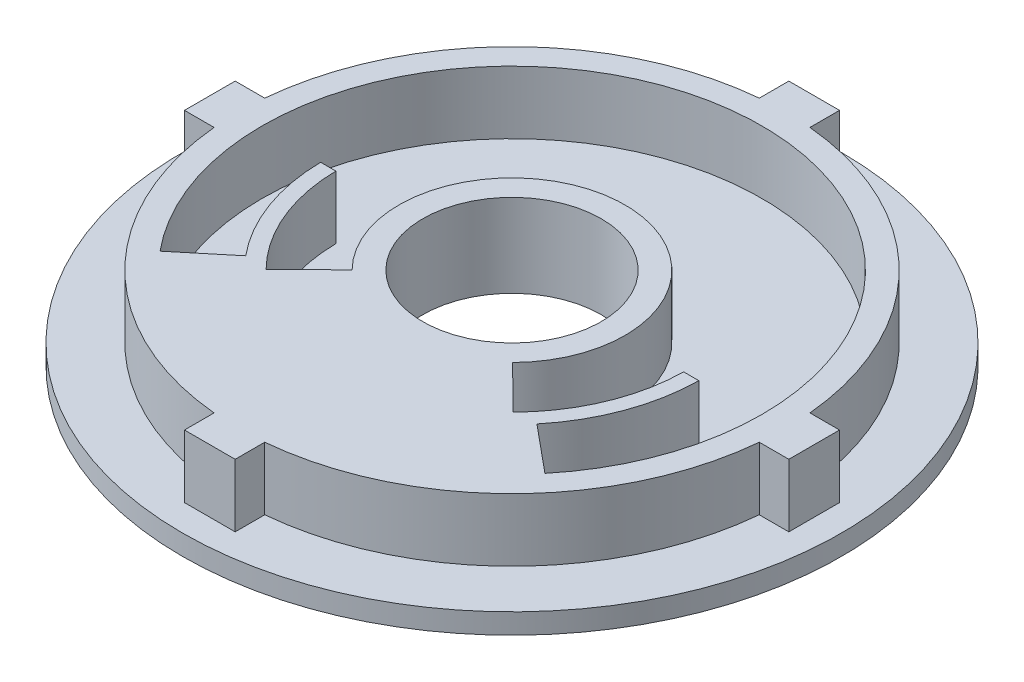
ISO-10303-21;
HEADER;
FILE_DESCRIPTION(('STEP AP214'),'2;1');
FILE_NAME('part.step','',(''),(''),'','','');
FILE_SCHEMA(('AUTOMOTIVE_DESIGN { 1 0 10303 214 1 1 1 1 }'));
ENDSEC;
DATA;
#1=APPLICATION_CONTEXT('core data for automotive mechanical design processes');
#2=APPLICATION_PROTOCOL_DEFINITION('international standard','automotive_design',2000,#1);
#3=PRODUCT_CONTEXT('',#1,'mechanical');
#4=PRODUCT('Part','Part','',(#3));
#5=PRODUCT_RELATED_PRODUCT_CATEGORY('part','',(#4));
#6=PRODUCT_DEFINITION_FORMATION('','',#4);
#7=PRODUCT_DEFINITION_CONTEXT('part definition',#1,'design');
#8=PRODUCT_DEFINITION('design','',#6,#7);
#9=PRODUCT_DEFINITION_SHAPE('','',#8);
#10=(LENGTH_UNIT() NAMED_UNIT(*) SI_UNIT(.MILLI.,.METRE.));
#11=(NAMED_UNIT(*) PLANE_ANGLE_UNIT() SI_UNIT($,.RADIAN.));
#12=(NAMED_UNIT(*) SI_UNIT($,.STERADIAN.) SOLID_ANGLE_UNIT());
#13=UNCERTAINTY_MEASURE_WITH_UNIT(LENGTH_MEASURE(1.E-05),#10,'distance_accuracy_value','');
#14=(GEOMETRIC_REPRESENTATION_CONTEXT(3) GLOBAL_UNCERTAINTY_ASSIGNED_CONTEXT((#13)) GLOBAL_UNIT_ASSIGNED_CONTEXT((#10,
#11,#12)) REPRESENTATION_CONTEXT('',''));
#15=CARTESIAN_POINT('',(0.,0.,0.));
#16=DIRECTION('',(0.,0.,1.));
#17=DIRECTION('',(1.,0.,0.));
#18=AXIS2_PLACEMENT_3D('',#15,#16,#17);
#19=CARTESIAN_POINT('',(0.,6.2,0.));
#20=DIRECTION('',(0.,-1.,0.));
#21=DIRECTION('',(0.,0.,-1.));
#22=AXIS2_PLACEMENT_3D('',#19,#20,#21);
#23=CYLINDRICAL_SURFACE('',#22,18.65);
#24=CARTESIAN_POINT('',(0.,0.,0.));
#25=DIRECTION('',(0.,-1.,0.));
#26=DIRECTION('',(0.,0.,-1.));
#27=AXIS2_PLACEMENT_3D('',#24,#25,#26);
#28=CIRCLE('',#27,18.65);
#29=CARTESIAN_POINT('',(-14.3583068280382,0.,11.9021647204158));
#30=VERTEX_POINT('',#29);
#31=CARTESIAN_POINT('',(-18.6486866118202,0.,0.221331547946306));
#32=VERTEX_POINT('',#31);
#33=EDGE_CURVE('E294',#30,#32,#28,.T.);
#34=ORIENTED_EDGE('',*,*,#33,.F.);
#35=DIRECTION('',(0.,-1.,0.));
#36=VECTOR('',#35,1.);
#37=CARTESIAN_POINT('',(-14.3583068280382,6.2,11.9021647204158));
#38=LINE('',#37,#36);
#39=CARTESIAN_POINT('',(-14.3583068280382,6.2,11.9021647204158));
#40=VERTEX_POINT('',#39);
#41=EDGE_CURVE('E239',#30,#40,#38,.F.);
#42=ORIENTED_EDGE('',*,*,#41,.T.);
#43=CARTESIAN_POINT('',(0.,6.2,0.));
#44=DIRECTION('',(0.,-1.,0.));
#45=DIRECTION('',(0.,0.,-1.));
#46=AXIS2_PLACEMENT_3D('',#43,#44,#45);
#47=CIRCLE('',#46,18.65);
#48=CARTESIAN_POINT('',(-18.6486866118202,6.2,0.221331547946306));
#49=VERTEX_POINT('',#48);
#50=EDGE_CURVE('E225',#40,#49,#47,.T.);
#51=ORIENTED_EDGE('',*,*,#50,.T.);
#52=DIRECTION('',(0.,-1.,0.));
#53=VECTOR('',#52,1.);
#54=CARTESIAN_POINT('',(-18.6486866118202,6.2,0.221331547946306));
#55=LINE('',#54,#53);
#56=EDGE_CURVE('E255',#49,#32,#55,.T.);
#57=ORIENTED_EDGE('',*,*,#56,.T.);
#58=EDGE_LOOP('',(#34,#42,#51,#57));
#59=FACE_BOUND('',#58,.T.);
#60=ADVANCED_FACE('F37',(#59),#23,.T.);
#61=CARTESIAN_POINT('',(0.,6.2,0.));
#62=DIRECTION('',(0.,-1.,0.));
#63=DIRECTION('',(0.,0.,-1.));
#64=AXIS2_PLACEMENT_3D('',#61,#62,#63);
#65=CYLINDRICAL_SURFACE('',#64,24.65);
#66=DIRECTION('',(0.,-1.,0.));
#67=VECTOR('',#66,1.);
#68=CARTESIAN_POINT('',(18.9776012499272,16.1484826050477,15.7312793757775));
#69=LINE('',#68,#67);
#70=CARTESIAN_POINT('',(18.9776012499272,6.2,15.7312793757774));
#71=VERTEX_POINT('',#70);
#72=CARTESIAN_POINT('',(18.9776012499272,0.,15.7312793757774));
#73=VERTEX_POINT('',#72);
#74=EDGE_CURVE('E59',#71,#73,#69,.T.);
#75=ORIENTED_EDGE('',*,*,#74,.F.);
#76=CARTESIAN_POINT('',(0.,6.2,0.));
#77=DIRECTION('',(0.,1.,0.));
#78=DIRECTION('',(0.,0.,1.));
#79=AXIS2_PLACEMENT_3D('',#76,#77,#78);
#80=CIRCLE('',#79,24.65);
#81=CARTESIAN_POINT('',(-18.9776012499272,6.2,15.7312793757774));
#82=VERTEX_POINT('',#81);
#83=EDGE_CURVE('E231',#71,#82,#80,.T.);
#84=ORIENTED_EDGE('',*,*,#83,.T.);
#85=DIRECTION('',(0.,-1.,0.));
#86=VECTOR('',#85,1.);
#87=CARTESIAN_POINT('',(-18.9776012499272,16.1484826050477,15.7312793757775));
#88=LINE('',#87,#86);
#89=CARTESIAN_POINT('',(-18.9776012499272,0.,15.7312793757775));
#90=VERTEX_POINT('',#89);
#91=EDGE_CURVE('E229',#82,#90,#88,.T.);
#92=ORIENTED_EDGE('',*,*,#91,.T.);
#93=CARTESIAN_POINT('',(0.,0.,0.));
#94=DIRECTION('',(0.,1.,0.));
#95=DIRECTION('',(0.,0.,1.));
#96=AXIS2_PLACEMENT_3D('',#93,#94,#95);
#97=CIRCLE('',#96,24.65);
#98=EDGE_CURVE('E220',#73,#90,#97,.T.);
#99=ORIENTED_EDGE('',*,*,#98,.F.);
#100=EDGE_LOOP('',(#75,#84,#92,#99));
#101=FACE_BOUND('',#100,.T.);
#102=ADVANCED_FACE('F230',(#101),#65,.F.);
#103=CARTESIAN_POINT('',(0.,0.,0.));
#104=DIRECTION('',(0.,-1.,0.));
#105=DIRECTION('',(0.,0.,-1.));
#106=AXIS2_PLACEMENT_3D('',#103,#104,#105);
#107=PLANE('',#106);
#108=CARTESIAN_POINT('',(0.,0.,0.));
#109=DIRECTION('',(0.,-1.,0.));
#110=DIRECTION('',(0.,0.,1.));
#111=AXIS2_PLACEMENT_3D('',#108,#109,#110);
#112=CIRCLE('',#111,18.65);
#113=CARTESIAN_POINT('',(18.6486866118202,0.,0.221331547946306));
#114=VERTEX_POINT('',#113);
#115=CARTESIAN_POINT('',(14.3583068280382,0.,11.9021647204158));
#116=VERTEX_POINT('',#115);
#117=EDGE_CURVE('E226',#114,#116,#112,.T.);
#118=ORIENTED_EDGE('',*,*,#117,.T.);
#119=DIRECTION('',(0.769882403648162,0.,0.638185775893609));
#120=VECTOR('',#119,1.);
#121=CARTESIAN_POINT('',(18.9776012499272,0.,15.7312793757775));
#122=LINE('',#121,#120);
#123=EDGE_CURVE('E52',#116,#73,#122,.T.);
#124=ORIENTED_EDGE('',*,*,#123,.T.);
#125=ORIENTED_EDGE('',*,*,#98,.T.);
#126=DIRECTION('',(-0.769882403648162,0.,0.638185775893609));
#127=VECTOR('',#126,1.);
#128=CARTESIAN_POINT('',(0.,0.,0.));
#129=LINE('',#128,#127);
#130=EDGE_CURVE('E45',#30,#90,#129,.T.);
#131=ORIENTED_EDGE('',*,*,#130,.F.);
#132=ORIENTED_EDGE('',*,*,#33,.T.);
#133=DIRECTION('',(0.999999999625579,0.,2.73649931491843E-05));
#134=VECTOR('',#133,1.);
#135=CARTESIAN_POINT('',(-18.6486866118202,0.,0.221331547946306));
#136=LINE('',#135,#134);
#137=CARTESIAN_POINT('',(-17.148571199158,0.,0.221372598594317));
#138=VERTEX_POINT('',#137);
#139=EDGE_CURVE('E291',#32,#138,#136,.T.);
#140=ORIENTED_EDGE('',*,*,#139,.T.);
#141=CARTESIAN_POINT('',(0.,0.,0.));
#142=DIRECTION('',(0.,1.,0.));
#143=DIRECTION('',(0.,0.,-1.));
#144=AXIS2_PLACEMENT_3D('',#141,#142,#143);
#145=CIRCLE('',#144,17.15);
#146=CARTESIAN_POINT('',(-12.1754563894523,0.,12.0781108501514));
#147=VERTEX_POINT('',#146);
#148=EDGE_CURVE('E289',#138,#147,#145,.T.);
#149=ORIENTED_EDGE('',*,*,#148,.T.);
#150=DIRECTION('',(0.709939148073023,0.,-0.704263023332441));
#151=VECTOR('',#150,1.);
#152=CARTESIAN_POINT('',(-12.1754563894523,0.,12.0781108501514));
#153=LINE('',#152,#151);
#154=CARTESIAN_POINT('',(-7.91582150101419,0.,7.85253271015673));
#155=VERTEX_POINT('',#154);
#156=EDGE_CURVE('E286',#147,#155,#153,.T.);
#157=ORIENTED_EDGE('',*,*,#156,.T.);
#158=CARTESIAN_POINT('',(0.,0.,0.));
#159=DIRECTION('',(0.,-1.,0.));
#160=DIRECTION('',(0.,0.,1.));
#161=AXIS2_PLACEMENT_3D('',#158,#159,#160);
#162=CIRCLE('',#161,11.15);
#163=CARTESIAN_POINT('',(7.9158215010142,0.,7.85253271015673));
#164=VERTEX_POINT('',#163);
#165=EDGE_CURVE('E283',#155,#164,#162,.T.);
#166=ORIENTED_EDGE('',*,*,#165,.T.);
#167=DIRECTION('',(0.709939148073023,0.,0.704263023332441));
#168=VECTOR('',#167,1.);
#169=CARTESIAN_POINT('',(12.1754563894523,0.,12.0781108501514));
#170=LINE('',#169,#168);
#171=CARTESIAN_POINT('',(12.1754563894523,0.,12.0781108501514));
#172=VERTEX_POINT('',#171);
#173=EDGE_CURVE('E280',#164,#172,#170,.T.);
#174=ORIENTED_EDGE('',*,*,#173,.T.);
#175=CARTESIAN_POINT('',(0.,0.,0.));
#176=DIRECTION('',(0.,1.,0.));
#177=DIRECTION('',(0.,0.,1.));
#178=AXIS2_PLACEMENT_3D('',#175,#176,#177);
#179=CIRCLE('',#178,17.15);
#180=CARTESIAN_POINT('',(17.148571199158,0.,0.221372598594312));
#181=VERTEX_POINT('',#180);
#182=EDGE_CURVE('E278',#172,#181,#179,.T.);
#183=ORIENTED_EDGE('',*,*,#182,.T.);
#184=DIRECTION('',(0.999999999625579,0.,-2.73649931491843E-05));
#185=VECTOR('',#184,1.);
#186=CARTESIAN_POINT('',(18.6486866118202,0.,0.221331547946306));
#187=LINE('',#186,#185);
#188=EDGE_CURVE('E275',#181,#114,#187,.T.);
#189=ORIENTED_EDGE('',*,*,#188,.T.);
#190=EDGE_LOOP('',(#118,#124,#125,#131,#132,#140,#149,#157,#166,#174,#183,#189));
#191=FACE_BOUND('',#190,.T.);
#192=ADVANCED_FACE('F222',(#191),#107,.F.);
#193=CARTESIAN_POINT('',(0.,6.2,0.));
#194=DIRECTION('',(0.,-1.,0.));
#195=DIRECTION('',(0.,0.,-1.));
#196=AXIS2_PLACEMENT_3D('',#193,#194,#195);
#197=CYLINDRICAL_SURFACE('',#196,27.);
#198=DIRECTION('',(0.,-1.,0.));
#199=VECTOR('',#198,1.);
#200=CARTESIAN_POINT('',(-26.8840101175404,6.2,-2.49999999999735));
#201=LINE('',#200,#199);
#202=CARTESIAN_POINT('',(-26.8840101175404,6.2,-2.49999999999735));
#203=VERTEX_POINT('',#202);
#204=CARTESIAN_POINT('',(-26.8840101175404,0.,-2.49999999999735));
#205=VERTEX_POINT('',#204);
#206=EDGE_CURVE('E405',#203,#205,#201,.T.);
#207=ORIENTED_EDGE('',*,*,#206,.F.);
#208=CARTESIAN_POINT('',(0.,6.2,0.));
#209=DIRECTION('',(0.,1.,0.));
#210=DIRECTION('',(0.,0.,1.));
#211=AXIS2_PLACEMENT_3D('',#208,#209,#210);
#212=CIRCLE('',#211,27.);
#213=CARTESIAN_POINT('',(-2.5,6.2,-26.8840101175401));
#214=VERTEX_POINT('',#213);
#215=EDGE_CURVE('E242',#214,#203,#212,.T.);
#216=ORIENTED_EDGE('',*,*,#215,.F.);
#217=DIRECTION('',(0.,-1.,0.));
#218=VECTOR('',#217,1.);
#219=CARTESIAN_POINT('',(-2.5,6.2,-26.8840101175401));
#220=LINE('',#219,#218);
#221=CARTESIAN_POINT('',(-2.5,0.,-26.8840101175401));
#222=VERTEX_POINT('',#221);
#223=EDGE_CURVE('E328',#222,#214,#220,.F.);
#224=ORIENTED_EDGE('',*,*,#223,.F.);
#225=CARTESIAN_POINT('',(0.,0.,0.));
#226=DIRECTION('',(0.,1.,0.));
#227=DIRECTION('',(0.,0.,1.));
#228=AXIS2_PLACEMENT_3D('',#225,#226,#227);
#229=CIRCLE('',#228,27.);
#230=EDGE_CURVE('E245',#222,#205,#229,.T.);
#231=ORIENTED_EDGE('',*,*,#230,.T.);
#232=EDGE_LOOP('',(#207,#216,#224,#231));
#233=FACE_BOUND('',#232,.T.);
#234=ADVANCED_FACE('F39',(#233),#197,.T.);
#235=DIRECTION('',(0.,-1.,0.));
#236=VECTOR('',#235,1.);
#237=CARTESIAN_POINT('',(-26.8840101175399,6.2,2.50000000000265));
#238=LINE('',#237,#236);
#239=CARTESIAN_POINT('',(-26.8840101175399,0.,2.50000000000265));
#240=VERTEX_POINT('',#239);
#241=CARTESIAN_POINT('',(-26.8840101175399,6.2,2.50000000000265));
#242=VERTEX_POINT('',#241);
#243=EDGE_CURVE('E412',#240,#242,#238,.F.);
#244=ORIENTED_EDGE('',*,*,#243,.F.);
#245=CARTESIAN_POINT('',(-2.49999999999417,0.,26.8840101175407));
#246=VERTEX_POINT('',#245);
#247=EDGE_CURVE('E249',#240,#246,#229,.T.);
#248=ORIENTED_EDGE('',*,*,#247,.T.);
#249=DIRECTION('',(0.,-1.,0.));
#250=VECTOR('',#249,1.);
#251=CARTESIAN_POINT('',(-2.49999999999417,6.2,26.8840101175407));
#252=LINE('',#251,#250);
#253=CARTESIAN_POINT('',(-2.49999999999417,6.2,26.8840101175407));
#254=VERTEX_POINT('',#253);
#255=EDGE_CURVE('E376',#254,#246,#252,.T.);
#256=ORIENTED_EDGE('',*,*,#255,.F.);
#257=EDGE_CURVE('E253',#242,#254,#212,.T.);
#258=ORIENTED_EDGE('',*,*,#257,.F.);
#259=EDGE_LOOP('',(#244,#248,#256,#258));
#260=FACE_BOUND('',#259,.T.);
#261=ADVANCED_FACE('F524',(#260),#197,.T.);
#262=CARTESIAN_POINT('',(0.,0.,0.));
#263=DIRECTION('',(0.,-1.,0.));
#264=DIRECTION('',(0.,0.,-1.));
#265=AXIS2_PLACEMENT_3D('',#262,#263,#264);
#266=CIRCLE('',#265,32.5);
#267=CARTESIAN_POINT('',(0.,0.,-32.5));
#268=VERTEX_POINT('',#267);
#269=EDGE_CURVE('E316',#268,#268,#266,.T.);
#270=ORIENTED_EDGE('',*,*,#269,.F.);
#271=EDGE_LOOP('',(#270));
#272=FACE_BOUND('',#271,.T.);
#273=DIRECTION('',(-1.,0.,0.));
#274=VECTOR('',#273,1.);
#275=CARTESIAN_POINT('',(-29.7999999999968,0.,-2.49999999999735));
#276=LINE('',#275,#274);
#277=CARTESIAN_POINT('',(-29.7999999999968,0.,-2.49999999999735));
#278=VERTEX_POINT('',#277);
#279=EDGE_CURVE('E424',#205,#278,#276,.T.);
#280=ORIENTED_EDGE('',*,*,#279,.F.);
#281=ORIENTED_EDGE('',*,*,#230,.F.);
#282=DIRECTION('',(0.,0.,1.));
#283=VECTOR('',#282,1.);
#284=CARTESIAN_POINT('',(-2.5,0.,-29.8));
#285=LINE('',#284,#283);
#286=CARTESIAN_POINT('',(-2.5,0.,-29.8));
#287=VERTEX_POINT('',#286);
#288=EDGE_CURVE('E335',#287,#222,#285,.T.);
#289=ORIENTED_EDGE('',*,*,#288,.F.);
#290=DIRECTION('',(-1.,0.,0.));
#291=VECTOR('',#290,1.);
#292=CARTESIAN_POINT('',(-2.5,0.,-29.8));
#293=LINE('',#292,#291);
#294=CARTESIAN_POINT('',(2.5,0.,-29.8));
#295=VERTEX_POINT('',#294);
#296=EDGE_CURVE('E336',#295,#287,#293,.T.);
#297=ORIENTED_EDGE('',*,*,#296,.F.);
#298=DIRECTION('',(0.,0.,-1.));
#299=VECTOR('',#298,1.);
#300=CARTESIAN_POINT('',(2.5,0.,0.));
#301=LINE('',#300,#299);
#302=CARTESIAN_POINT('',(2.5,0.,-26.8840101175401));
#303=VERTEX_POINT('',#302);
#304=EDGE_CURVE('E240',#303,#295,#301,.T.);
#305=ORIENTED_EDGE('',*,*,#304,.F.);
#306=CARTESIAN_POINT('',(26.8840101175398,0.,-2.50000000000318));
#307=VERTEX_POINT('',#306);
#308=EDGE_CURVE('E250',#307,#303,#229,.T.);
#309=ORIENTED_EDGE('',*,*,#308,.F.);
#310=DIRECTION('',(-1.,0.,0.));
#311=VECTOR('',#310,1.);
#312=CARTESIAN_POINT('',(29.8000000000026,0.,-2.50000000000318));
#313=LINE('',#312,#311);
#314=CARTESIAN_POINT('',(29.8000000000026,0.,-2.50000000000318));
#315=VERTEX_POINT('',#314);
#316=EDGE_CURVE('E361',#315,#307,#313,.T.);
#317=ORIENTED_EDGE('',*,*,#316,.F.);
#318=DIRECTION('',(0.,0.,-1.));
#319=VECTOR('',#318,1.);
#320=CARTESIAN_POINT('',(29.8000000000026,0.,-2.50000000000318));
#321=LINE('',#320,#319);
#322=CARTESIAN_POINT('',(29.8000000000026,0.,2.49999999999682));
#323=VERTEX_POINT('',#322);
#324=EDGE_CURVE('E362',#323,#315,#321,.T.);
#325=ORIENTED_EDGE('',*,*,#324,.F.);
#326=DIRECTION('',(1.,0.,0.));
#327=VECTOR('',#326,1.);
#328=CARTESIAN_POINT('',(29.8000000000026,0.,2.49999999999682));
#329=LINE('',#328,#327);
#330=CARTESIAN_POINT('',(26.8840101175404,0.,2.49999999999682));
#331=VERTEX_POINT('',#330);
#332=EDGE_CURVE('E366',#331,#323,#329,.T.);
#333=ORIENTED_EDGE('',*,*,#332,.F.);
#334=CARTESIAN_POINT('',(2.50000000000583,0.,26.8840101175396));
#335=VERTEX_POINT('',#334);
#336=EDGE_CURVE('E566',#335,#331,#229,.T.);
#337=ORIENTED_EDGE('',*,*,#336,.F.);
#338=DIRECTION('',(0.,0.,-1.));
#339=VECTOR('',#338,1.);
#340=CARTESIAN_POINT('',(2.50000000000583,0.,29.7999999999995));
#341=LINE('',#340,#339);
#342=CARTESIAN_POINT('',(2.50000000000583,0.,29.7999999999995));
#343=VERTEX_POINT('',#342);
#344=EDGE_CURVE('E390',#343,#335,#341,.T.);
#345=ORIENTED_EDGE('',*,*,#344,.F.);
#346=DIRECTION('',(1.,0.,0.));
#347=VECTOR('',#346,1.);
#348=CARTESIAN_POINT('',(2.50000000000583,0.,29.7999999999995));
#349=LINE('',#348,#347);
#350=CARTESIAN_POINT('',(-2.49999999999417,0.,29.7999999999995));
#351=VERTEX_POINT('',#350);
#352=EDGE_CURVE('E391',#351,#343,#349,.T.);
#353=ORIENTED_EDGE('',*,*,#352,.F.);
#354=DIRECTION('',(0.,0.,1.));
#355=VECTOR('',#354,1.);
#356=CARTESIAN_POINT('',(-2.49999999999417,0.,29.7999999999995));
#357=LINE('',#356,#355);
#358=EDGE_CURVE('E395',#246,#351,#357,.T.);
#359=ORIENTED_EDGE('',*,*,#358,.F.);
#360=ORIENTED_EDGE('',*,*,#247,.F.);
#361=DIRECTION('',(1.,0.,0.));
#362=VECTOR('',#361,1.);
#363=CARTESIAN_POINT('',(-29.7999999999968,0.,2.50000000000265));
#364=LINE('',#363,#362);
#365=CARTESIAN_POINT('',(-29.7999999999968,0.,2.50000000000265));
#366=VERTEX_POINT('',#365);
#367=EDGE_CURVE('E419',#366,#240,#364,.T.);
#368=ORIENTED_EDGE('',*,*,#367,.F.);
#369=DIRECTION('',(0.,0.,1.));
#370=VECTOR('',#369,1.);
#371=CARTESIAN_POINT('',(-29.7999999999968,0.,2.50000000000265));
#372=LINE('',#371,#370);
#373=EDGE_CURVE('E420',#278,#366,#372,.T.);
#374=ORIENTED_EDGE('',*,*,#373,.F.);
#375=EDGE_LOOP('',(#280,#281,#289,#297,#305,#309,#317,#325,#333,#337,#345,#353,#359,#360,#368,#374));
#376=FACE_BOUND('',#375,.T.);
#377=ADVANCED_FACE('F522',(#272,#376),#107,.F.);
#378=DIRECTION('',(0.,-1.,0.));
#379=VECTOR('',#378,1.);
#380=CARTESIAN_POINT('',(2.50000000000583,6.2,26.8840101175396));
#381=LINE('',#380,#379);
#382=CARTESIAN_POINT('',(2.50000000000583,6.2,26.8840101175396));
#383=VERTEX_POINT('',#382);
#384=EDGE_CURVE('E383',#335,#383,#381,.F.);
#385=ORIENTED_EDGE('',*,*,#384,.F.);
#386=ORIENTED_EDGE('',*,*,#336,.T.);
#387=DIRECTION('',(0.,-1.,0.));
#388=VECTOR('',#387,1.);
#389=CARTESIAN_POINT('',(26.8840101175404,6.2,2.49999999999682));
#390=LINE('',#389,#388);
#391=CARTESIAN_POINT('',(26.8840101175404,6.2,2.49999999999682));
#392=VERTEX_POINT('',#391);
#393=EDGE_CURVE('E340',#392,#331,#390,.T.);
#394=ORIENTED_EDGE('',*,*,#393,.F.);
#395=EDGE_CURVE('E550',#383,#392,#212,.T.);
#396=ORIENTED_EDGE('',*,*,#395,.F.);
#397=EDGE_LOOP('',(#385,#386,#394,#396));
#398=FACE_BOUND('',#397,.T.);
#399=ADVANCED_FACE('F517',(#398),#197,.T.);
#400=DIRECTION('',(0.,-1.,0.));
#401=VECTOR('',#400,1.);
#402=CARTESIAN_POINT('',(26.8840101175398,6.2,-2.50000000000318));
#403=LINE('',#402,#401);
#404=CARTESIAN_POINT('',(26.8840101175398,6.2,-2.50000000000318));
#405=VERTEX_POINT('',#404);
#406=EDGE_CURVE('E354',#307,#405,#403,.F.);
#407=ORIENTED_EDGE('',*,*,#406,.F.);
#408=ORIENTED_EDGE('',*,*,#308,.T.);
#409=DIRECTION('',(0.,-1.,0.));
#410=VECTOR('',#409,1.);
#411=CARTESIAN_POINT('',(2.5,6.2,-26.8840101175401));
#412=LINE('',#411,#410);
#413=CARTESIAN_POINT('',(2.5,6.2,-26.8840101175401));
#414=VERTEX_POINT('',#413);
#415=EDGE_CURVE('E325',#414,#303,#412,.T.);
#416=ORIENTED_EDGE('',*,*,#415,.F.);
#417=EDGE_CURVE('E254',#405,#414,#212,.T.);
#418=ORIENTED_EDGE('',*,*,#417,.F.);
#419=EDGE_LOOP('',(#407,#408,#416,#418));
#420=FACE_BOUND('',#419,.T.);
#421=ADVANCED_FACE('F512',(#420),#197,.T.);
#422=CARTESIAN_POINT('',(0.,6.2,0.));
#423=DIRECTION('',(0.,1.,0.));
#424=DIRECTION('',(0.,0.,1.));
#425=AXIS2_PLACEMENT_3D('',#422,#423,#424);
#426=PLANE('',#425);
#427=ORIENTED_EDGE('',*,*,#83,.F.);
#428=DIRECTION('',(0.769882403648162,0.,0.638185775893609));
#429=VECTOR('',#428,1.);
#430=CARTESIAN_POINT('',(18.9776012499272,6.2,15.7312793757775));
#431=LINE('',#430,#429);
#432=CARTESIAN_POINT('',(14.3583068280382,6.2,11.9021647204158));
#433=VERTEX_POINT('',#432);
#434=EDGE_CURVE('E441',#433,#71,#431,.T.);
#435=ORIENTED_EDGE('',*,*,#434,.F.);
#436=CARTESIAN_POINT('',(0.,6.2,0.));
#437=DIRECTION('',(0.,-1.,0.));
#438=DIRECTION('',(0.,0.,1.));
#439=AXIS2_PLACEMENT_3D('',#436,#437,#438);
#440=CIRCLE('',#439,18.65);
#441=CARTESIAN_POINT('',(18.6486866118202,6.2,0.221331547946306));
#442=VERTEX_POINT('',#441);
#443=EDGE_CURVE('E297',#442,#433,#440,.T.);
#444=ORIENTED_EDGE('',*,*,#443,.F.);
#445=DIRECTION('',(0.999999999625579,0.,-2.73649931491843E-05));
#446=VECTOR('',#445,1.);
#447=CARTESIAN_POINT('',(18.6486866118202,6.2,0.221331547946306));
#448=LINE('',#447,#446);
#449=CARTESIAN_POINT('',(17.148571199158,6.2,0.221372598594312));
#450=VERTEX_POINT('',#449);
#451=EDGE_CURVE('E299',#450,#442,#448,.T.);
#452=ORIENTED_EDGE('',*,*,#451,.F.);
#453=CARTESIAN_POINT('',(0.,6.2,0.));
#454=DIRECTION('',(0.,1.,0.));
#455=DIRECTION('',(0.,0.,1.));
#456=AXIS2_PLACEMENT_3D('',#453,#454,#455);
#457=CIRCLE('',#456,17.15);
#458=CARTESIAN_POINT('',(12.1754563894523,6.2,12.0781108501514));
#459=VERTEX_POINT('',#458);
#460=EDGE_CURVE('E301',#459,#450,#457,.T.);
#461=ORIENTED_EDGE('',*,*,#460,.F.);
#462=DIRECTION('',(0.709939148073023,0.,0.704263023332441));
#463=VECTOR('',#462,1.);
#464=CARTESIAN_POINT('',(12.1754563894523,6.2,12.0781108501514));
#465=LINE('',#464,#463);
#466=CARTESIAN_POINT('',(7.9158215010142,6.2,7.85253271015673));
#467=VERTEX_POINT('',#466);
#468=EDGE_CURVE('E303',#467,#459,#465,.T.);
#469=ORIENTED_EDGE('',*,*,#468,.F.);
#470=CARTESIAN_POINT('',(0.,6.2,0.));
#471=DIRECTION('',(0.,-1.,0.));
#472=DIRECTION('',(0.,0.,1.));
#473=AXIS2_PLACEMENT_3D('',#470,#471,#472);
#474=CIRCLE('',#473,11.15);
#475=CARTESIAN_POINT('',(-7.91582150101419,6.2,7.85253271015673));
#476=VERTEX_POINT('',#475);
#477=EDGE_CURVE('E305',#476,#467,#474,.T.);
#478=ORIENTED_EDGE('',*,*,#477,.F.);
#479=DIRECTION('',(0.709939148073023,0.,-0.704263023332441));
#480=VECTOR('',#479,1.);
#481=CARTESIAN_POINT('',(-12.1754563894523,6.2,12.0781108501514));
#482=LINE('',#481,#480);
#483=CARTESIAN_POINT('',(-12.1754563894523,6.2,12.0781108501514));
#484=VERTEX_POINT('',#483);
#485=EDGE_CURVE('E307',#484,#476,#482,.T.);
#486=ORIENTED_EDGE('',*,*,#485,.F.);
#487=CARTESIAN_POINT('',(0.,6.2,0.));
#488=DIRECTION('',(0.,1.,0.));
#489=DIRECTION('',(0.,0.,-1.));
#490=AXIS2_PLACEMENT_3D('',#487,#488,#489);
#491=CIRCLE('',#490,17.15);
#492=CARTESIAN_POINT('',(-17.148571199158,6.2,0.221372598594317));
#493=VERTEX_POINT('',#492);
#494=EDGE_CURVE('E309',#493,#484,#491,.T.);
#495=ORIENTED_EDGE('',*,*,#494,.F.);
#496=DIRECTION('',(0.999999999625579,0.,2.73649931491843E-05));
#497=VECTOR('',#496,1.);
#498=CARTESIAN_POINT('',(-18.6486866118202,6.2,0.221331547946306));
#499=LINE('',#498,#497);
#500=EDGE_CURVE('E311',#49,#493,#499,.T.);
#501=ORIENTED_EDGE('',*,*,#500,.F.);
#502=ORIENTED_EDGE('',*,*,#50,.F.);
#503=DIRECTION('',(-0.769882403648162,0.,0.638185775893609));
#504=VECTOR('',#503,1.);
#505=CARTESIAN_POINT('',(-18.9776012499272,6.2,15.7312793757775));
#506=LINE('',#505,#504);
#507=EDGE_CURVE('E235',#40,#82,#506,.T.);
#508=ORIENTED_EDGE('',*,*,#507,.T.);
#509=EDGE_LOOP('',(#427,#435,#444,#452,#461,#469,#478,#486,#495,#501,#502,#508));
#510=FACE_BOUND('',#509,.T.);
#511=CARTESIAN_POINT('',(0.,6.2,0.));
#512=DIRECTION('',(0.,1.,0.));
#513=DIRECTION('',(0.,0.,1.));
#514=AXIS2_PLACEMENT_3D('',#511,#512,#513);
#515=CIRCLE('',#514,8.8);
#516=CARTESIAN_POINT('',(0.,6.2,-8.8));
#517=VERTEX_POINT('',#516);
#518=EDGE_CURVE('E248',#517,#517,#515,.T.);
#519=ORIENTED_EDGE('',*,*,#518,.F.);
#520=EDGE_LOOP('',(#519));
#521=FACE_BOUND('',#520,.T.);
#522=ORIENTED_EDGE('',*,*,#215,.T.);
#523=DIRECTION('',(-1.,0.,0.));
#524=VECTOR('',#523,1.);
#525=CARTESIAN_POINT('',(-29.7999999999968,6.2,-2.49999999999735));
#526=LINE('',#525,#524);
#527=CARTESIAN_POINT('',(-29.7999999999968,6.2,-2.49999999999735));
#528=VERTEX_POINT('',#527);
#529=EDGE_CURVE('E428',#203,#528,#526,.T.);
#530=ORIENTED_EDGE('',*,*,#529,.T.);
#531=DIRECTION('',(0.,0.,1.));
#532=VECTOR('',#531,1.);
#533=CARTESIAN_POINT('',(-29.7999999999968,6.2,2.50000000000265));
#534=LINE('',#533,#532);
#535=CARTESIAN_POINT('',(-29.7999999999968,6.2,2.50000000000265));
#536=VERTEX_POINT('',#535);
#537=EDGE_CURVE('E415',#528,#536,#534,.T.);
#538=ORIENTED_EDGE('',*,*,#537,.T.);
#539=DIRECTION('',(1.,0.,0.));
#540=VECTOR('',#539,1.);
#541=CARTESIAN_POINT('',(-29.7999999999968,6.2,2.50000000000265));
#542=LINE('',#541,#540);
#543=EDGE_CURVE('E425',#536,#242,#542,.T.);
#544=ORIENTED_EDGE('',*,*,#543,.T.);
#545=ORIENTED_EDGE('',*,*,#257,.T.);
#546=DIRECTION('',(0.,0.,1.));
#547=VECTOR('',#546,1.);
#548=CARTESIAN_POINT('',(-2.49999999999417,6.2,29.7999999999995));
#549=LINE('',#548,#547);
#550=CARTESIAN_POINT('',(-2.49999999999417,6.2,29.7999999999995));
#551=VERTEX_POINT('',#550);
#552=EDGE_CURVE('E399',#254,#551,#549,.T.);
#553=ORIENTED_EDGE('',*,*,#552,.T.);
#554=DIRECTION('',(1.,0.,0.));
#555=VECTOR('',#554,1.);
#556=CARTESIAN_POINT('',(2.50000000000583,6.2,29.7999999999995));
#557=LINE('',#556,#555);
#558=CARTESIAN_POINT('',(2.50000000000583,6.2,29.7999999999995));
#559=VERTEX_POINT('',#558);
#560=EDGE_CURVE('E386',#551,#559,#557,.T.);
#561=ORIENTED_EDGE('',*,*,#560,.T.);
#562=DIRECTION('',(0.,0.,-1.));
#563=VECTOR('',#562,1.);
#564=CARTESIAN_POINT('',(2.50000000000583,6.2,29.7999999999995));
#565=LINE('',#564,#563);
#566=EDGE_CURVE('E396',#559,#383,#565,.T.);
#567=ORIENTED_EDGE('',*,*,#566,.T.);
#568=ORIENTED_EDGE('',*,*,#395,.T.);
#569=DIRECTION('',(1.,0.,0.));
#570=VECTOR('',#569,1.);
#571=CARTESIAN_POINT('',(29.8000000000026,6.2,2.49999999999682));
#572=LINE('',#571,#570);
#573=CARTESIAN_POINT('',(29.8000000000026,6.2,2.49999999999682));
#574=VERTEX_POINT('',#573);
#575=EDGE_CURVE('E370',#392,#574,#572,.T.);
#576=ORIENTED_EDGE('',*,*,#575,.T.);
#577=DIRECTION('',(0.,0.,-1.));
#578=VECTOR('',#577,1.);
#579=CARTESIAN_POINT('',(29.8000000000026,6.2,-2.50000000000318));
#580=LINE('',#579,#578);
#581=CARTESIAN_POINT('',(29.8000000000026,6.2,-2.50000000000318));
#582=VERTEX_POINT('',#581);
#583=EDGE_CURVE('E357',#574,#582,#580,.T.);
#584=ORIENTED_EDGE('',*,*,#583,.T.);
#585=DIRECTION('',(-1.,0.,0.));
#586=VECTOR('',#585,1.);
#587=CARTESIAN_POINT('',(29.8000000000026,6.2,-2.50000000000318));
#588=LINE('',#587,#586);
#589=EDGE_CURVE('E367',#582,#405,#588,.T.);
#590=ORIENTED_EDGE('',*,*,#589,.T.);
#591=ORIENTED_EDGE('',*,*,#417,.T.);
#592=DIRECTION('',(0.,0.,-1.));
#593=VECTOR('',#592,1.);
#594=CARTESIAN_POINT('',(2.5,6.2,-29.8));
#595=LINE('',#594,#593);
#596=CARTESIAN_POINT('',(2.5,6.2,-29.8));
#597=VERTEX_POINT('',#596);
#598=EDGE_CURVE('E341',#414,#597,#595,.T.);
#599=ORIENTED_EDGE('',*,*,#598,.T.);
#600=DIRECTION('',(-1.,0.,0.));
#601=VECTOR('',#600,1.);
#602=CARTESIAN_POINT('',(-2.5,6.2,-29.8));
#603=LINE('',#602,#601);
#604=CARTESIAN_POINT('',(-2.5,6.2,-29.8));
#605=VERTEX_POINT('',#604);
#606=EDGE_CURVE('E343',#597,#605,#603,.T.);
#607=ORIENTED_EDGE('',*,*,#606,.T.);
#608=DIRECTION('',(0.,0.,1.));
#609=VECTOR('',#608,1.);
#610=CARTESIAN_POINT('',(-2.5,6.2,-29.8));
#611=LINE('',#610,#609);
#612=EDGE_CURVE('E331',#605,#214,#611,.T.);
#613=ORIENTED_EDGE('',*,*,#612,.T.);
#614=EDGE_LOOP('',(#522,#530,#538,#544,#545,#553,#561,#567,#568,#576,#584,#590,#591,#599,#607,#613));
#615=FACE_BOUND('',#614,.T.);
#616=ADVANCED_FACE('F449',(#510,#521,#615),#426,.T.);
#617=CARTESIAN_POINT('',(-18.6486866118202,6.2,0.221331547946306));
#618=DIRECTION('',(2.73649931491843E-05,0.,-0.999999999625579));
#619=DIRECTION('',(-0.999999999625579,0.,-2.73649931491843E-05));
#620=AXIS2_PLACEMENT_3D('',#617,#618,#619);
#621=PLANE('',#620);
#622=ORIENTED_EDGE('',*,*,#139,.F.);
#623=ORIENTED_EDGE('',*,*,#56,.F.);
#624=ORIENTED_EDGE('',*,*,#500,.T.);
#625=DIRECTION('',(0.,-1.,0.));
#626=VECTOR('',#625,1.);
#627=CARTESIAN_POINT('',(-17.148571199158,6.2,0.221372598594317));
#628=LINE('',#627,#626);
#629=EDGE_CURVE('E258',#493,#138,#628,.T.);
#630=ORIENTED_EDGE('',*,*,#629,.T.);
#631=EDGE_LOOP('',(#622,#623,#624,#630));
#632=FACE_BOUND('',#631,.T.);
#633=ADVANCED_FACE('F459',(#632),#621,.T.);
#634=CARTESIAN_POINT('',(0.,6.2,0.));
#635=DIRECTION('',(0.,-1.,0.));
#636=DIRECTION('',(0.,0.,-1.));
#637=AXIS2_PLACEMENT_3D('',#634,#635,#636);
#638=CYLINDRICAL_SURFACE('',#637,17.15);
#639=DIRECTION('',(0.,-1.,0.));
#640=VECTOR('',#639,1.);
#641=CARTESIAN_POINT('',(-12.1754563894523,6.2,12.0781108501514));
#642=LINE('',#641,#640);
#643=EDGE_CURVE('E260',#484,#147,#642,.T.);
#644=ORIENTED_EDGE('',*,*,#643,.T.);
#645=ORIENTED_EDGE('',*,*,#148,.F.);
#646=ORIENTED_EDGE('',*,*,#629,.F.);
#647=ORIENTED_EDGE('',*,*,#494,.T.);
#648=EDGE_LOOP('',(#644,#645,#646,#647));
#649=FACE_BOUND('',#648,.T.);
#650=ADVANCED_FACE('F465',(#649),#638,.F.);
#651=CARTESIAN_POINT('',(-12.1754563894523,6.2,12.0781108501514));
#652=DIRECTION('',(-0.704263023332441,0.,-0.709939148073022));
#653=DIRECTION('',(-0.709939148073023,0.,0.704263023332442));
#654=AXIS2_PLACEMENT_3D('',#651,#652,#653);
#655=PLANE('',#654);
#656=ORIENTED_EDGE('',*,*,#156,.F.);
#657=ORIENTED_EDGE('',*,*,#643,.F.);
#658=ORIENTED_EDGE('',*,*,#485,.T.);
#659=DIRECTION('',(0.,-1.,0.));
#660=VECTOR('',#659,1.);
#661=CARTESIAN_POINT('',(-7.91582150101419,6.2,7.85253271015673));
#662=LINE('',#661,#660);
#663=EDGE_CURVE('E263',#476,#155,#662,.T.);
#664=ORIENTED_EDGE('',*,*,#663,.T.);
#665=EDGE_LOOP('',(#656,#657,#658,#664));
#666=FACE_BOUND('',#665,.T.);
#667=ADVANCED_FACE('F468',(#666),#655,.T.);
#668=CARTESIAN_POINT('',(0.,6.2,0.));
#669=DIRECTION('',(0.,-1.,0.));
#670=DIRECTION('',(0.,0.,-1.));
#671=AXIS2_PLACEMENT_3D('',#668,#669,#670);
#672=CYLINDRICAL_SURFACE('',#671,11.15);
#673=ORIENTED_EDGE('',*,*,#165,.F.);
#674=ORIENTED_EDGE('',*,*,#663,.F.);
#675=ORIENTED_EDGE('',*,*,#477,.T.);
#676=DIRECTION('',(0.,-1.,0.));
#677=VECTOR('',#676,1.);
#678=CARTESIAN_POINT('',(7.9158215010142,6.2,7.85253271015673));
#679=LINE('',#678,#677);
#680=EDGE_CURVE('E265',#467,#164,#679,.T.);
#681=ORIENTED_EDGE('',*,*,#680,.T.);
#682=EDGE_LOOP('',(#673,#674,#675,#681));
#683=FACE_BOUND('',#682,.T.);
#684=ADVANCED_FACE('F473',(#683),#672,.T.);
#685=CARTESIAN_POINT('',(12.1754563894523,6.2,12.0781108501514));
#686=DIRECTION('',(0.704263023332441,0.,-0.709939148073022));
#687=DIRECTION('',(-0.709939148073023,0.,-0.704263023332442));
#688=AXIS2_PLACEMENT_3D('',#685,#686,#687);
#689=PLANE('',#688);
#690=ORIENTED_EDGE('',*,*,#173,.F.);
#691=ORIENTED_EDGE('',*,*,#680,.F.);
#692=ORIENTED_EDGE('',*,*,#468,.T.);
#693=DIRECTION('',(0.,-1.,0.));
#694=VECTOR('',#693,1.);
#695=CARTESIAN_POINT('',(12.1754563894523,6.2,12.0781108501514));
#696=LINE('',#695,#694);
#697=EDGE_CURVE('E267',#459,#172,#696,.T.);
#698=ORIENTED_EDGE('',*,*,#697,.T.);
#699=EDGE_LOOP('',(#690,#691,#692,#698));
#700=FACE_BOUND('',#699,.T.);
#701=ADVANCED_FACE('F478',(#700),#689,.T.);
#702=CARTESIAN_POINT('',(0.,6.2,0.));
#703=DIRECTION('',(0.,-1.,0.));
#704=DIRECTION('',(0.,0.,-1.));
#705=AXIS2_PLACEMENT_3D('',#702,#703,#704);
#706=CYLINDRICAL_SURFACE('',#705,17.15);
#707=DIRECTION('',(0.,-1.,0.));
#708=VECTOR('',#707,1.);
#709=CARTESIAN_POINT('',(17.148571199158,6.2,0.221372598594312));
#710=LINE('',#709,#708);
#711=EDGE_CURVE('E269',#450,#181,#710,.T.);
#712=ORIENTED_EDGE('',*,*,#711,.T.);
#713=ORIENTED_EDGE('',*,*,#182,.F.);
#714=ORIENTED_EDGE('',*,*,#697,.F.);
#715=ORIENTED_EDGE('',*,*,#460,.T.);
#716=EDGE_LOOP('',(#712,#713,#714,#715));
#717=FACE_BOUND('',#716,.T.);
#718=ADVANCED_FACE('F483',(#717),#706,.F.);
#719=CARTESIAN_POINT('',(18.6486866118202,6.2,0.221331547946306));
#720=DIRECTION('',(-2.73649931491843E-05,0.,-0.999999999625579));
#721=DIRECTION('',(-0.999999999625579,0.,2.73649931491843E-05));
#722=AXIS2_PLACEMENT_3D('',#719,#720,#721);
#723=PLANE('',#722);
#724=ORIENTED_EDGE('',*,*,#188,.F.);
#725=ORIENTED_EDGE('',*,*,#711,.F.);
#726=ORIENTED_EDGE('',*,*,#451,.T.);
#727=DIRECTION('',(0.,-1.,0.));
#728=VECTOR('',#727,1.);
#729=CARTESIAN_POINT('',(18.6486866118202,6.2,0.221331547946306));
#730=LINE('',#729,#728);
#731=EDGE_CURVE('E272',#442,#114,#730,.T.);
#732=ORIENTED_EDGE('',*,*,#731,.T.);
#733=EDGE_LOOP('',(#724,#725,#726,#732));
#734=FACE_BOUND('',#733,.T.);
#735=ADVANCED_FACE('F487',(#734),#723,.T.);
#736=CARTESIAN_POINT('',(0.,6.2,0.));
#737=DIRECTION('',(0.,-1.,0.));
#738=DIRECTION('',(0.,0.,-1.));
#739=AXIS2_PLACEMENT_3D('',#736,#737,#738);
#740=CYLINDRICAL_SURFACE('',#739,18.65);
#741=DIRECTION('',(0.,-1.,0.));
#742=VECTOR('',#741,1.);
#743=CARTESIAN_POINT('',(14.3583068280382,6.2,11.9021647204158));
#744=LINE('',#743,#742);
#745=EDGE_CURVE('E11',#116,#433,#744,.F.);
#746=ORIENTED_EDGE('',*,*,#745,.F.);
#747=ORIENTED_EDGE('',*,*,#117,.F.);
#748=ORIENTED_EDGE('',*,*,#731,.F.);
#749=ORIENTED_EDGE('',*,*,#443,.T.);
#750=EDGE_LOOP('',(#746,#747,#748,#749));
#751=FACE_BOUND('',#750,.T.);
#752=ADVANCED_FACE('F491',(#751),#740,.T.);
#753=CARTESIAN_POINT('',(0.,6.2,0.));
#754=DIRECTION('',(0.,-1.,0.));
#755=DIRECTION('',(0.,0.,-1.));
#756=AXIS2_PLACEMENT_3D('',#753,#754,#755);
#757=CYLINDRICAL_SURFACE('',#756,8.8);
#758=CARTESIAN_POINT('',(0.,-2.,0.));
#759=DIRECTION('',(0.,-1.,0.));
#760=DIRECTION('',(0.,0.,-1.));
#761=AXIS2_PLACEMENT_3D('',#758,#759,#760);
#762=CIRCLE('',#761,8.8);
#763=CARTESIAN_POINT('',(0.,-2.,-8.8));
#764=VERTEX_POINT('',#763);
#765=EDGE_CURVE('E320',#764,#764,#762,.T.);
#766=CARTESIAN_POINT('',(0.,6.2,-8.8));
#767=CARTESIAN_POINT('',(0.,6.11458333333333,-8.8));
#768=CARTESIAN_POINT('',(0.,6.02916666666667,-8.8));
#769=CARTESIAN_POINT('',(0.,5.85833333333333,-8.8));
#770=CARTESIAN_POINT('',(0.,5.77291666666667,-8.8));
#771=CARTESIAN_POINT('',(0.,5.60208333333333,-8.8));
#772=CARTESIAN_POINT('',(0.,5.51666666666667,-8.8));
#773=CARTESIAN_POINT('',(0.,5.34583333333333,-8.8));
#774=CARTESIAN_POINT('',(0.,5.26041666666667,-8.8));
#775=CARTESIAN_POINT('',(0.,5.08958333333333,-8.8));
#776=CARTESIAN_POINT('',(0.,5.00416666666667,-8.8));
#777=CARTESIAN_POINT('',(0.,4.83333333333333,-8.8));
#778=CARTESIAN_POINT('',(0.,4.74791666666667,-8.8));
#779=CARTESIAN_POINT('',(0.,4.57708333333333,-8.8));
#780=CARTESIAN_POINT('',(0.,4.49166666666667,-8.8));
#781=CARTESIAN_POINT('',(0.,4.32083333333333,-8.8));
#782=CARTESIAN_POINT('',(0.,4.23541666666667,-8.8));
#783=CARTESIAN_POINT('',(0.,4.06458333333333,-8.8));
#784=CARTESIAN_POINT('',(0.,3.97916666666667,-8.8));
#785=CARTESIAN_POINT('',(0.,3.80833333333333,-8.8));
#786=CARTESIAN_POINT('',(0.,3.72291666666667,-8.8));
#787=CARTESIAN_POINT('',(0.,3.55208333333333,-8.8));
#788=CARTESIAN_POINT('',(0.,3.46666666666667,-8.8));
#789=CARTESIAN_POINT('',(0.,3.29583333333333,-8.8));
#790=CARTESIAN_POINT('',(0.,3.21041666666667,-8.8));
#791=CARTESIAN_POINT('',(0.,3.03958333333333,-8.8));
#792=CARTESIAN_POINT('',(0.,2.95416666666667,-8.8));
#793=CARTESIAN_POINT('',(0.,2.78333333333333,-8.8));
#794=CARTESIAN_POINT('',(0.,2.69791666666667,-8.8));
#795=CARTESIAN_POINT('',(0.,2.52708333333333,-8.8));
#796=CARTESIAN_POINT('',(0.,2.44166666666667,-8.8));
#797=CARTESIAN_POINT('',(0.,2.27083333333333,-8.8));
#798=CARTESIAN_POINT('',(0.,2.18541666666667,-8.8));
#799=CARTESIAN_POINT('',(0.,2.01458333333333,-8.8));
#800=CARTESIAN_POINT('',(0.,1.92916666666666,-8.8));
#801=CARTESIAN_POINT('',(0.,1.75833333333333,-8.8));
#802=CARTESIAN_POINT('',(0.,1.67291666666667,-8.8));
#803=CARTESIAN_POINT('',(0.,1.50208333333333,-8.8));
#804=CARTESIAN_POINT('',(0.,1.41666666666666,-8.8));
#805=CARTESIAN_POINT('',(0.,1.24583333333333,-8.8));
#806=CARTESIAN_POINT('',(0.,1.16041666666667,-8.8));
#807=CARTESIAN_POINT('',(0.,0.989583333333332,-8.8));
#808=CARTESIAN_POINT('',(0.,0.904166666666665,-8.8));
#809=CARTESIAN_POINT('',(0.,0.733333333333332,-8.8));
#810=CARTESIAN_POINT('',(0.,0.647916666666665,-8.8));
#811=CARTESIAN_POINT('',(0.,0.477083333333331,-8.8));
#812=CARTESIAN_POINT('',(0.,0.391666666666665,-8.8));
#813=CARTESIAN_POINT('',(0.,0.220833333333332,-8.8));
#814=CARTESIAN_POINT('',(0.,0.135416666666665,-8.8));
#815=CARTESIAN_POINT('',(0.,-0.0354166666666688,-8.8));
#816=CARTESIAN_POINT('',(0.,-0.120833333333336,-8.8));
#817=CARTESIAN_POINT('',(0.,-0.291666666666669,-8.8));
#818=CARTESIAN_POINT('',(0.,-0.377083333333335,-8.8));
#819=CARTESIAN_POINT('',(0.,-0.547916666666669,-8.8));
#820=CARTESIAN_POINT('',(0.,-0.633333333333336,-8.8));
#821=CARTESIAN_POINT('',(0.,-0.804166666666669,-8.8));
#822=CARTESIAN_POINT('',(0.,-0.889583333333336,-8.8));
#823=CARTESIAN_POINT('',(0.,-1.06041666666667,-8.8));
#824=CARTESIAN_POINT('',(0.,-1.14583333333334,-8.8));
#825=CARTESIAN_POINT('',(0.,-1.31666666666667,-8.8));
#826=CARTESIAN_POINT('',(0.,-1.40208333333334,-8.8));
#827=CARTESIAN_POINT('',(0.,-1.57291666666667,-8.8));
#828=CARTESIAN_POINT('',(0.,-1.65833333333334,-8.8));
#829=CARTESIAN_POINT('',(0.,-1.82916666666667,-8.8));
#830=CARTESIAN_POINT('',(0.,-1.91458333333333,-8.8));
#831=CARTESIAN_POINT('',(0.,-2.,-8.8));
#832=B_SPLINE_CURVE_WITH_KNOTS('',3,(#766,#767,#768,#769,#770,#771,#772,#773,#774,#775,#776,
#777,#778,#779,#780,#781,#782,#783,#784,#785,#786,#787,#788,#789,#790,#791,#792,#793,#794,#795,
#796,#797,#798,#799,#800,#801,#802,#803,#804,#805,#806,#807,#808,#809,#810,#811,#812,#813,#814,
#815,#816,#817,#818,#819,#820,#821,#822,#823,#824,#825,#826,#827,#828,#829,#830,#831),
.UNSPECIFIED.,.F.,.F.,(4,2,2,2,2,2,2,2,2,2,2,2,2,2,2,2,2,2,2,2,2,2,2,2,2,2,2,2,2,2,2,2,4),(0.,
0.25625,0.5125,0.768749999999999,1.025,1.28125,1.5375,1.79375,2.05,2.30625,2.5625,2.81875,3.075,
3.33125,3.5875,3.84375,4.1,4.35625,4.6125,4.86875,5.125,5.38125,5.6375,5.89375,6.15,6.40625,
6.6625,6.91875,7.175,7.43125,7.6875,7.94375,8.2),.UNSPECIFIED.);
#833=EDGE_CURVE('BSEAM493',#517,#764,#832,.T.);
#834=ORIENTED_EDGE('',*,*,#518,.T.);
#835=ORIENTED_EDGE('',*,*,#765,.T.);
#836=ORIENTED_EDGE('',*,*,#833,.T.);
#837=ORIENTED_EDGE('',*,*,#833,.F.);
#838=EDGE_LOOP('',(#834,#836,#835,#837));
#839=FACE_BOUND('',#838,.T.);
#840=ADVANCED_FACE('F493',(#839),#757,.F.);
#841=CARTESIAN_POINT('',(0.,-2.,0.));
#842=DIRECTION('',(0.,-1.,0.));
#843=DIRECTION('',(0.,0.,-1.));
#844=AXIS2_PLACEMENT_3D('',#841,#842,#843);
#845=PLANE('',#844);
#846=CARTESIAN_POINT('',(0.,-2.,0.));
#847=DIRECTION('',(0.,-1.,0.));
#848=DIRECTION('',(0.,0.,-1.));
#849=AXIS2_PLACEMENT_3D('',#846,#847,#848);
#850=CIRCLE('',#849,32.5);
#851=CARTESIAN_POINT('',(0.,-2.,-32.5));
#852=VERTEX_POINT('',#851);
#853=EDGE_CURVE('E319',#852,#852,#850,.T.);
#854=ORIENTED_EDGE('',*,*,#853,.T.);
#855=EDGE_LOOP('',(#854));
#856=FACE_BOUND('',#855,.T.);
#857=ORIENTED_EDGE('',*,*,#765,.F.);
#858=EDGE_LOOP('',(#857));
#859=FACE_BOUND('',#858,.T.);
#860=ADVANCED_FACE('F499',(#856,#859),#845,.T.);
#861=CARTESIAN_POINT('',(0.,-2.,0.));
#862=DIRECTION('',(0.,1.,0.));
#863=DIRECTION('',(0.,0.,1.));
#864=AXIS2_PLACEMENT_3D('',#861,#862,#863);
#865=CYLINDRICAL_SURFACE('',#864,32.5);
#866=ORIENTED_EDGE('',*,*,#853,.F.);
#867=EDGE_LOOP('',(#866));
#868=FACE_BOUND('',#867,.T.);
#869=ORIENTED_EDGE('',*,*,#269,.T.);
#870=EDGE_LOOP('',(#869));
#871=FACE_BOUND('',#870,.T.);
#872=ADVANCED_FACE('F596',(#868,#871),#865,.T.);
#873=CARTESIAN_POINT('',(2.5,12.8581990815808,-29.8));
#874=DIRECTION('',(-1.,0.,0.));
#875=DIRECTION('',(0.,0.,1.));
#876=AXIS2_PLACEMENT_3D('',#873,#874,#875);
#877=PLANE('',#876);
#878=ORIENTED_EDGE('',*,*,#598,.F.);
#879=ORIENTED_EDGE('',*,*,#415,.T.);
#880=ORIENTED_EDGE('',*,*,#304,.T.);
#881=DIRECTION('',(0.,-1.,0.));
#882=VECTOR('',#881,1.);
#883=CARTESIAN_POINT('',(2.5,12.8581990815808,-29.8));
#884=LINE('',#883,#882);
#885=EDGE_CURVE('E337',#597,#295,#884,.T.);
#886=ORIENTED_EDGE('',*,*,#885,.F.);
#887=EDGE_LOOP('',(#878,#879,#880,#886));
#888=FACE_BOUND('',#887,.T.);
#889=ADVANCED_FACE('F559',(#888),#877,.F.);
#890=CARTESIAN_POINT('',(-2.5,12.8581990815808,-29.8));
#891=DIRECTION('',(1.,0.,0.));
#892=DIRECTION('',(0.,0.,-1.));
#893=AXIS2_PLACEMENT_3D('',#890,#891,#892);
#894=PLANE('',#893);
#895=ORIENTED_EDGE('',*,*,#288,.T.);
#896=ORIENTED_EDGE('',*,*,#223,.T.);
#897=ORIENTED_EDGE('',*,*,#612,.F.);
#898=DIRECTION('',(0.,-1.,0.));
#899=VECTOR('',#898,1.);
#900=CARTESIAN_POINT('',(-2.5,12.8581990815808,-29.8));
#901=LINE('',#900,#899);
#902=EDGE_CURVE('E332',#605,#287,#901,.T.);
#903=ORIENTED_EDGE('',*,*,#902,.T.);
#904=EDGE_LOOP('',(#895,#896,#897,#903));
#905=FACE_BOUND('',#904,.T.);
#906=ADVANCED_FACE('F564',(#905),#894,.F.);
#907=CARTESIAN_POINT('',(-2.5,12.8581990815808,-29.8));
#908=DIRECTION('',(0.,0.,1.));
#909=DIRECTION('',(1.,0.,0.));
#910=AXIS2_PLACEMENT_3D('',#907,#908,#909);
#911=PLANE('',#910);
#912=ORIENTED_EDGE('',*,*,#606,.F.);
#913=ORIENTED_EDGE('',*,*,#885,.T.);
#914=ORIENTED_EDGE('',*,*,#296,.T.);
#915=ORIENTED_EDGE('',*,*,#902,.F.);
#916=EDGE_LOOP('',(#912,#913,#914,#915));
#917=FACE_BOUND('',#916,.T.);
#918=ADVANCED_FACE('F561',(#917),#911,.F.);
#919=CARTESIAN_POINT('',(29.8000000000026,12.8581990815808,2.49999999999682));
#920=DIRECTION('',(0.,0.,-1.));
#921=DIRECTION('',(-1.,0.,0.));
#922=AXIS2_PLACEMENT_3D('',#919,#920,#921);
#923=PLANE('',#922);
#924=ORIENTED_EDGE('',*,*,#575,.F.);
#925=ORIENTED_EDGE('',*,*,#393,.T.);
#926=ORIENTED_EDGE('',*,*,#332,.T.);
#927=DIRECTION('',(0.,-1.,0.));
#928=VECTOR('',#927,1.);
#929=CARTESIAN_POINT('',(29.8000000000026,12.8581990815808,2.49999999999682));
#930=LINE('',#929,#928);
#931=EDGE_CURVE('E363',#574,#323,#930,.T.);
#932=ORIENTED_EDGE('',*,*,#931,.F.);
#933=EDGE_LOOP('',(#924,#925,#926,#932));
#934=FACE_BOUND('',#933,.T.);
#935=ADVANCED_FACE('F572',(#934),#923,.F.);
#936=CARTESIAN_POINT('',(29.8000000000026,12.8581990815808,-2.50000000000318));
#937=DIRECTION('',(0.,0.,1.));
#938=DIRECTION('',(1.,0.,0.));
#939=AXIS2_PLACEMENT_3D('',#936,#937,#938);
#940=PLANE('',#939);
#941=ORIENTED_EDGE('',*,*,#316,.T.);
#942=ORIENTED_EDGE('',*,*,#406,.T.);
#943=ORIENTED_EDGE('',*,*,#589,.F.);
#944=DIRECTION('',(0.,-1.,0.));
#945=VECTOR('',#944,1.);
#946=CARTESIAN_POINT('',(29.8000000000026,12.8581990815808,-2.50000000000318));
#947=LINE('',#946,#945);
#948=EDGE_CURVE('E358',#582,#315,#947,.T.);
#949=ORIENTED_EDGE('',*,*,#948,.T.);
#950=EDGE_LOOP('',(#941,#942,#943,#949));
#951=FACE_BOUND('',#950,.T.);
#952=ADVANCED_FACE('F577',(#951),#940,.F.);
#953=CARTESIAN_POINT('',(29.8000000000026,12.8581990815808,-2.50000000000318));
#954=DIRECTION('',(-1.,0.,0.));
#955=DIRECTION('',(0.,0.,1.));
#956=AXIS2_PLACEMENT_3D('',#953,#954,#955);
#957=PLANE('',#956);
#958=ORIENTED_EDGE('',*,*,#583,.F.);
#959=ORIENTED_EDGE('',*,*,#931,.T.);
#960=ORIENTED_EDGE('',*,*,#324,.T.);
#961=ORIENTED_EDGE('',*,*,#948,.F.);
#962=EDGE_LOOP('',(#958,#959,#960,#961));
#963=FACE_BOUND('',#962,.T.);
#964=ADVANCED_FACE('F575',(#963),#957,.F.);
#965=CARTESIAN_POINT('',(-2.49999999999417,12.8581990815808,29.7999999999995));
#966=DIRECTION('',(1.,0.,0.));
#967=DIRECTION('',(0.,0.,-1.));
#968=AXIS2_PLACEMENT_3D('',#965,#966,#967);
#969=PLANE('',#968);
#970=ORIENTED_EDGE('',*,*,#552,.F.);
#971=ORIENTED_EDGE('',*,*,#255,.T.);
#972=ORIENTED_EDGE('',*,*,#358,.T.);
#973=DIRECTION('',(0.,-1.,0.));
#974=VECTOR('',#973,1.);
#975=CARTESIAN_POINT('',(-2.49999999999417,12.8581990815808,29.7999999999995));
#976=LINE('',#975,#974);
#977=EDGE_CURVE('E392',#551,#351,#976,.T.);
#978=ORIENTED_EDGE('',*,*,#977,.F.);
#979=EDGE_LOOP('',(#970,#971,#972,#978));
#980=FACE_BOUND('',#979,.T.);
#981=ADVANCED_FACE('F584',(#980),#969,.F.);
#982=CARTESIAN_POINT('',(2.50000000000583,12.8581990815808,29.7999999999995));
#983=DIRECTION('',(-1.,0.,0.));
#984=DIRECTION('',(0.,0.,1.));
#985=AXIS2_PLACEMENT_3D('',#982,#983,#984);
#986=PLANE('',#985);
#987=ORIENTED_EDGE('',*,*,#344,.T.);
#988=ORIENTED_EDGE('',*,*,#384,.T.);
#989=ORIENTED_EDGE('',*,*,#566,.F.);
#990=DIRECTION('',(0.,-1.,0.));
#991=VECTOR('',#990,1.);
#992=CARTESIAN_POINT('',(2.50000000000583,12.8581990815808,29.7999999999995));
#993=LINE('',#992,#991);
#994=EDGE_CURVE('E387',#559,#343,#993,.T.);
#995=ORIENTED_EDGE('',*,*,#994,.T.);
#996=EDGE_LOOP('',(#987,#988,#989,#995));
#997=FACE_BOUND('',#996,.T.);
#998=ADVANCED_FACE('F649',(#997),#986,.F.);
#999=CARTESIAN_POINT('',(2.50000000000583,12.8581990815808,29.7999999999995));
#1000=DIRECTION('',(0.,0.,-1.));
#1001=DIRECTION('',(-1.,0.,0.));
#1002=AXIS2_PLACEMENT_3D('',#999,#1000,#1001);
#1003=PLANE('',#1002);
#1004=ORIENTED_EDGE('',*,*,#560,.F.);
#1005=ORIENTED_EDGE('',*,*,#977,.T.);
#1006=ORIENTED_EDGE('',*,*,#352,.T.);
#1007=ORIENTED_EDGE('',*,*,#994,.F.);
#1008=EDGE_LOOP('',(#1004,#1005,#1006,#1007));
#1009=FACE_BOUND('',#1008,.T.);
#1010=ADVANCED_FACE('F658',(#1009),#1003,.F.);
#1011=CARTESIAN_POINT('',(-29.7999999999968,12.8581990815808,-2.49999999999735));
#1012=DIRECTION('',(0.,0.,1.));
#1013=DIRECTION('',(1.,0.,0.));
#1014=AXIS2_PLACEMENT_3D('',#1011,#1012,#1013);
#1015=PLANE('',#1014);
#1016=ORIENTED_EDGE('',*,*,#529,.F.);
#1017=ORIENTED_EDGE('',*,*,#206,.T.);
#1018=ORIENTED_EDGE('',*,*,#279,.T.);
#1019=DIRECTION('',(0.,-1.,0.));
#1020=VECTOR('',#1019,1.);
#1021=CARTESIAN_POINT('',(-29.7999999999968,12.8581990815808,-2.49999999999735));
#1022=LINE('',#1021,#1020);
#1023=EDGE_CURVE('E421',#528,#278,#1022,.T.);
#1024=ORIENTED_EDGE('',*,*,#1023,.F.);
#1025=EDGE_LOOP('',(#1016,#1017,#1018,#1024));
#1026=FACE_BOUND('',#1025,.T.);
#1027=ADVANCED_FACE('F540',(#1026),#1015,.F.);
#1028=CARTESIAN_POINT('',(-29.7999999999968,12.8581990815808,2.50000000000265));
#1029=DIRECTION('',(0.,0.,-1.));
#1030=DIRECTION('',(-1.,0.,0.));
#1031=AXIS2_PLACEMENT_3D('',#1028,#1029,#1030);
#1032=PLANE('',#1031);
#1033=ORIENTED_EDGE('',*,*,#367,.T.);
#1034=ORIENTED_EDGE('',*,*,#243,.T.);
#1035=ORIENTED_EDGE('',*,*,#543,.F.);
#1036=DIRECTION('',(0.,-1.,0.));
#1037=VECTOR('',#1036,1.);
#1038=CARTESIAN_POINT('',(-29.7999999999968,12.8581990815808,2.50000000000265));
#1039=LINE('',#1038,#1037);
#1040=EDGE_CURVE('E416',#536,#366,#1039,.T.);
#1041=ORIENTED_EDGE('',*,*,#1040,.T.);
#1042=EDGE_LOOP('',(#1033,#1034,#1035,#1041));
#1043=FACE_BOUND('',#1042,.T.);
#1044=ADVANCED_FACE('F546',(#1043),#1032,.F.);
#1045=CARTESIAN_POINT('',(-29.7999999999968,12.8581990815808,2.50000000000265));
#1046=DIRECTION('',(1.,0.,0.));
#1047=DIRECTION('',(0.,0.,-1.));
#1048=AXIS2_PLACEMENT_3D('',#1045,#1046,#1047);
#1049=PLANE('',#1048);
#1050=ORIENTED_EDGE('',*,*,#537,.F.);
#1051=ORIENTED_EDGE('',*,*,#1023,.T.);
#1052=ORIENTED_EDGE('',*,*,#373,.T.);
#1053=ORIENTED_EDGE('',*,*,#1040,.F.);
#1054=EDGE_LOOP('',(#1050,#1051,#1052,#1053));
#1055=FACE_BOUND('',#1054,.T.);
#1056=ADVANCED_FACE('F542',(#1055),#1049,.F.);
#1057=CARTESIAN_POINT('',(-18.9776012499272,16.1484826050477,15.7312793757775));
#1058=DIRECTION('',(0.638185775893609,0.,0.769882403648162));
#1059=DIRECTION('',(0.769882403648162,0.,-0.638185775893609));
#1060=AXIS2_PLACEMENT_3D('',#1057,#1058,#1059);
#1061=PLANE('',#1060);
#1062=ORIENTED_EDGE('',*,*,#41,.F.);
#1063=ORIENTED_EDGE('',*,*,#130,.T.);
#1064=ORIENTED_EDGE('',*,*,#91,.F.);
#1065=ORIENTED_EDGE('',*,*,#507,.F.);
#1066=EDGE_LOOP('',(#1062,#1063,#1064,#1065));
#1067=FACE_BOUND('',#1066,.T.);
#1068=ADVANCED_FACE('F238',(#1067),#1061,.F.);
#1069=CARTESIAN_POINT('',(18.9776012499272,16.1484826050477,15.7312793757775));
#1070=DIRECTION('',(0.638185775893609,0.,-0.769882403648162));
#1071=DIRECTION('',(-0.769882403648162,0.,-0.638185775893609));
#1072=AXIS2_PLACEMENT_3D('',#1069,#1070,#1071);
#1073=PLANE('',#1072);
#1074=ORIENTED_EDGE('',*,*,#123,.F.);
#1075=ORIENTED_EDGE('',*,*,#745,.T.);
#1076=ORIENTED_EDGE('',*,*,#434,.T.);
#1077=ORIENTED_EDGE('',*,*,#74,.T.);
#1078=EDGE_LOOP('',(#1074,#1075,#1076,#1077));
#1079=FACE_BOUND('',#1078,.T.);
#1080=ADVANCED_FACE('F446',(#1079),#1073,.T.);
#1081=CLOSED_SHELL('',(#60,#102,#192,#234,#261,#377,#399,#421,#616,#633,#650,#667,#684,#701,
#718,#735,#752,#840,#860,#872,#889,#906,#918,#935,#952,#964,#981,#998,#1010,#1027,#1044,#1056,
#1068,#1080));
#1082=MANIFOLD_SOLID_BREP('B2',#1081);
#1083=ADVANCED_BREP_SHAPE_REPRESENTATION('',(#18,#1082),#14);
#1084=SHAPE_DEFINITION_REPRESENTATION(#9,#1083);
ENDSEC;
END-ISO-10303-21;
